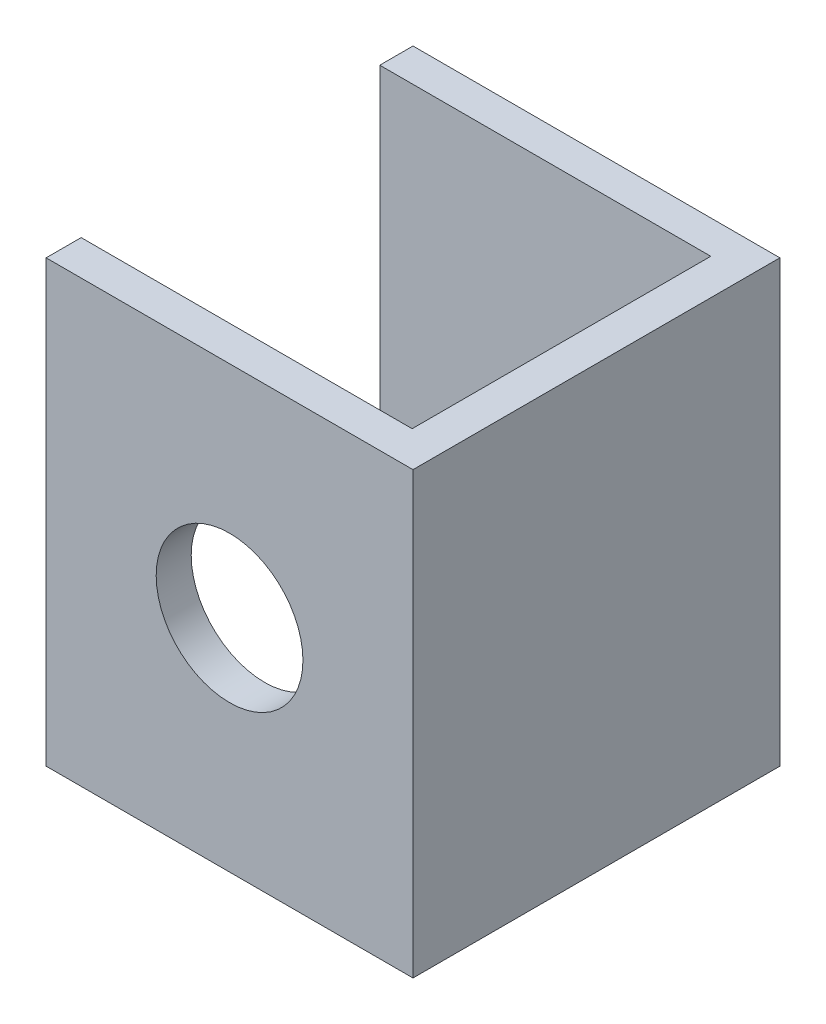
ISO-10303-21;
HEADER;
FILE_DESCRIPTION(('STEP AP214'),'2;1');
FILE_NAME('part.step','',(''),(''),'','','');
FILE_SCHEMA(('AUTOMOTIVE_DESIGN { 1 0 10303 214 1 1 1 1 }'));
ENDSEC;
DATA;
#1=APPLICATION_CONTEXT('core data for automotive mechanical design processes');
#2=APPLICATION_PROTOCOL_DEFINITION('international standard','automotive_design',2000,#1);
#3=PRODUCT_CONTEXT('',#1,'mechanical');
#4=PRODUCT('Part','Part','',(#3));
#5=PRODUCT_RELATED_PRODUCT_CATEGORY('part','',(#4));
#6=PRODUCT_DEFINITION_FORMATION('','',#4);
#7=PRODUCT_DEFINITION_CONTEXT('part definition',#1,'design');
#8=PRODUCT_DEFINITION('design','',#6,#7);
#9=PRODUCT_DEFINITION_SHAPE('','',#8);
#10=(LENGTH_UNIT() NAMED_UNIT(*) SI_UNIT(.MILLI.,.METRE.));
#11=(NAMED_UNIT(*) PLANE_ANGLE_UNIT() SI_UNIT($,.RADIAN.));
#12=(NAMED_UNIT(*) SI_UNIT($,.STERADIAN.) SOLID_ANGLE_UNIT());
#13=UNCERTAINTY_MEASURE_WITH_UNIT(LENGTH_MEASURE(1.E-05),#10,'distance_accuracy_value','');
#14=(GEOMETRIC_REPRESENTATION_CONTEXT(3) GLOBAL_UNCERTAINTY_ASSIGNED_CONTEXT((#13)) GLOBAL_UNIT_ASSIGNED_CONTEXT((#10,
#11,#12)) REPRESENTATION_CONTEXT('',''));
#15=CARTESIAN_POINT('',(0.,0.,0.));
#16=DIRECTION('',(0.,0.,1.));
#17=DIRECTION('',(1.,0.,0.));
#18=AXIS2_PLACEMENT_3D('',#15,#16,#17);
#19=CARTESIAN_POINT('',(0.,0.,0.));
#20=DIRECTION('',(1.,0.,0.));
#21=DIRECTION('',(0.,0.,-1.));
#22=AXIS2_PLACEMENT_3D('',#19,#20,#21);
#23=PLANE('',#22);
#24=DIRECTION('',(0.,0.,1.));
#25=VECTOR('',#24,1.);
#26=CARTESIAN_POINT('',(0.,37.3833238898768,-26.8421640295481));
#27=LINE('',#26,#25);
#28=CARTESIAN_POINT('',(0.,37.3833238898768,30.5946244034399));
#29=VERTEX_POINT('',#28);
#30=CARTESIAN_POINT('',(0.,37.3833238898768,36.6578359704519));
#31=VERTEX_POINT('',#30);
#32=EDGE_CURVE('E176',#29,#31,#27,.T.);
#33=ORIENTED_EDGE('',*,*,#32,.F.);
#34=DIRECTION('',(0.,-1.,0.));
#35=VECTOR('',#34,1.);
#36=CARTESIAN_POINT('',(0.,37.3833238898768,30.5946244034399));
#37=LINE('',#36,#35);
#38=CARTESIAN_POINT('',(0.,-38.8166761101232,30.5946244034398));
#39=VERTEX_POINT('',#38);
#40=EDGE_CURVE('E152',#29,#39,#37,.T.);
#41=ORIENTED_EDGE('',*,*,#40,.T.);
#42=DIRECTION('',(0.,0.,-1.));
#43=VECTOR('',#42,1.);
#44=CARTESIAN_POINT('',(0.,-38.8166761101232,-26.8421640295481));
#45=LINE('',#44,#43);
#46=CARTESIAN_POINT('',(0.,-38.8166761101232,36.6578359704519));
#47=VERTEX_POINT('',#46);
#48=EDGE_CURVE('E164',#47,#39,#45,.T.);
#49=ORIENTED_EDGE('',*,*,#48,.F.);
#50=DIRECTION('',(0.,-1.,0.));
#51=VECTOR('',#50,1.);
#52=CARTESIAN_POINT('',(0.,-38.8166761101232,36.6578359704519));
#53=LINE('',#52,#51);
#54=EDGE_CURVE('E179',#31,#47,#53,.T.);
#55=ORIENTED_EDGE('',*,*,#54,.F.);
#56=EDGE_LOOP('',(#33,#41,#49,#55));
#57=FACE_BOUND('',#56,.T.);
#58=ADVANCED_FACE('F41',(#57),#23,.F.);
#59=CARTESIAN_POINT('',(63.5,-38.8166761101232,-26.8421640295481));
#60=DIRECTION('',(0.,0.,1.));
#61=DIRECTION('',(1.,0.,0.));
#62=AXIS2_PLACEMENT_3D('',#59,#60,#61);
#63=PLANE('',#62);
#64=DIRECTION('',(0.,1.,0.));
#65=VECTOR('',#64,1.);
#66=CARTESIAN_POINT('',(0.,-38.8166761101232,-26.8421640295481));
#67=LINE('',#66,#65);
#68=CARTESIAN_POINT('',(0.,-38.8166761101232,-26.8421640295481));
#69=VERTEX_POINT('',#68);
#70=CARTESIAN_POINT('',(0.,37.3833238898768,-26.8421640295481));
#71=VERTEX_POINT('',#70);
#72=EDGE_CURVE('E156',#69,#71,#67,.T.);
#73=ORIENTED_EDGE('',*,*,#72,.T.);
#74=DIRECTION('',(-1.,0.,0.));
#75=VECTOR('',#74,1.);
#76=CARTESIAN_POINT('',(63.5,37.3833238898768,-26.8421640295481));
#77=LINE('',#76,#75);
#78=CARTESIAN_POINT('',(63.5,37.3833238898768,-26.8421640295481));
#79=VERTEX_POINT('',#78);
#80=EDGE_CURVE('E11',#79,#71,#77,.T.);
#81=ORIENTED_EDGE('',*,*,#80,.F.);
#82=DIRECTION('',(0.,1.,0.));
#83=VECTOR('',#82,1.);
#84=CARTESIAN_POINT('',(63.5,-38.8166761101232,-26.8421640295481));
#85=LINE('',#84,#83);
#86=CARTESIAN_POINT('',(63.5,-38.8166761101232,-26.8421640295481));
#87=VERTEX_POINT('',#86);
#88=EDGE_CURVE('E161',#87,#79,#85,.T.);
#89=ORIENTED_EDGE('',*,*,#88,.F.);
#90=DIRECTION('',(-1.,0.,0.));
#91=VECTOR('',#90,1.);
#92=CARTESIAN_POINT('',(63.5,-38.8166761101232,-26.8421640295481));
#93=LINE('',#92,#91);
#94=EDGE_CURVE('E172',#87,#69,#93,.T.);
#95=ORIENTED_EDGE('',*,*,#94,.T.);
#96=EDGE_LOOP('',(#73,#81,#89,#95));
#97=FACE_BOUND('',#96,.T.);
#98=ADVANCED_FACE('F43',(#97),#63,.F.);
#99=CARTESIAN_POINT('',(63.5,37.3833238898768,-26.8421640295481));
#100=DIRECTION('',(0.,-1.,0.));
#101=DIRECTION('',(0.,0.,-1.));
#102=AXIS2_PLACEMENT_3D('',#99,#100,#101);
#103=PLANE('',#102);
#104=DIRECTION('',(0.,0.,1.));
#105=VECTOR('',#104,1.);
#106=CARTESIAN_POINT('',(57.2887509634974,37.3833238898768,30.5946244034399));
#107=LINE('',#106,#105);
#108=CARTESIAN_POINT('',(57.2887509634974,37.3833238898768,-21.0937373749349));
#109=VERTEX_POINT('',#108);
#110=CARTESIAN_POINT('',(57.2887509634974,37.3833238898768,30.5946244034399));
#111=VERTEX_POINT('',#110);
#112=EDGE_CURVE('E126',#109,#111,#107,.T.);
#113=ORIENTED_EDGE('',*,*,#112,.T.);
#114=DIRECTION('',(-1.,0.,0.));
#115=VECTOR('',#114,1.);
#116=CARTESIAN_POINT('',(0.,37.3833238898768,30.5946244034399));
#117=LINE('',#116,#115);
#118=EDGE_CURVE('E131',#111,#29,#117,.T.);
#119=ORIENTED_EDGE('',*,*,#118,.T.);
#120=ORIENTED_EDGE('',*,*,#32,.T.);
#121=DIRECTION('',(-1.,0.,0.));
#122=VECTOR('',#121,1.);
#123=CARTESIAN_POINT('',(63.5,37.3833238898768,36.6578359704519));
#124=LINE('',#123,#122);
#125=CARTESIAN_POINT('',(63.5,37.3833238898768,36.6578359704519));
#126=VERTEX_POINT('',#125);
#127=EDGE_CURVE('E50',#126,#31,#124,.T.);
#128=ORIENTED_EDGE('',*,*,#127,.F.);
#129=DIRECTION('',(0.,0.,1.));
#130=VECTOR('',#129,1.);
#131=CARTESIAN_POINT('',(63.5,37.3833238898768,-26.8421640295481));
#132=LINE('',#131,#130);
#133=EDGE_CURVE('E94',#79,#126,#132,.T.);
#134=ORIENTED_EDGE('',*,*,#133,.F.);
#135=ORIENTED_EDGE('',*,*,#80,.T.);
#136=CARTESIAN_POINT('',(0.,37.3833238898768,-21.0937373749349));
#137=VERTEX_POINT('',#136);
#138=EDGE_CURVE('E135',#71,#137,#27,.T.);
#139=ORIENTED_EDGE('',*,*,#138,.T.);
#140=DIRECTION('',(1.,0.,0.));
#141=VECTOR('',#140,1.);
#142=CARTESIAN_POINT('',(0.,37.3833238898768,-21.0937373749349));
#143=LINE('',#142,#141);
#144=EDGE_CURVE('E57',#137,#109,#143,.T.);
#145=ORIENTED_EDGE('',*,*,#144,.T.);
#146=EDGE_LOOP('',(#113,#119,#120,#128,#134,#135,#139,#145));
#147=FACE_BOUND('',#146,.T.);
#148=ADVANCED_FACE('F134',(#147),#103,.F.);
#149=CARTESIAN_POINT('',(63.5,-38.8166761101232,36.6578359704519));
#150=DIRECTION('',(0.,0.,-1.));
#151=DIRECTION('',(-1.,0.,0.));
#152=AXIS2_PLACEMENT_3D('',#149,#150,#151);
#153=PLANE('',#152);
#154=CARTESIAN_POINT('',(31.75,-0.716676110123181,36.6578359704519));
#155=DIRECTION('',(0.,0.,1.));
#156=DIRECTION('',(1.,0.,0.));
#157=AXIS2_PLACEMENT_3D('',#154,#155,#156);
#158=CIRCLE('',#157,12.7);
#159=CARTESIAN_POINT('',(44.45,-0.716676110123181,36.6578359704519));
#160=VERTEX_POINT('',#159);
#161=EDGE_CURVE('E305',#160,#160,#158,.T.);
#162=ORIENTED_EDGE('',*,*,#161,.F.);
#163=EDGE_LOOP('',(#162));
#164=FACE_BOUND('',#163,.T.);
#165=ORIENTED_EDGE('',*,*,#54,.T.);
#166=DIRECTION('',(-1.,0.,0.));
#167=VECTOR('',#166,1.);
#168=CARTESIAN_POINT('',(63.5,-38.8166761101232,36.6578359704519));
#169=LINE('',#168,#167);
#170=CARTESIAN_POINT('',(63.5,-38.8166761101232,36.6578359704519));
#171=VERTEX_POINT('',#170);
#172=EDGE_CURVE('E187',#171,#47,#169,.T.);
#173=ORIENTED_EDGE('',*,*,#172,.F.);
#174=DIRECTION('',(0.,-1.,0.));
#175=VECTOR('',#174,1.);
#176=CARTESIAN_POINT('',(63.5,-38.8166761101232,36.6578359704519));
#177=LINE('',#176,#175);
#178=EDGE_CURVE('E167',#126,#171,#177,.T.);
#179=ORIENTED_EDGE('',*,*,#178,.F.);
#180=ORIENTED_EDGE('',*,*,#127,.T.);
#181=EDGE_LOOP('',(#165,#173,#179,#180));
#182=FACE_BOUND('',#181,.T.);
#183=ADVANCED_FACE('F195',(#164,#182),#153,.F.);
#184=CARTESIAN_POINT('',(63.5,-38.8166761101232,-26.8421640295481));
#185=DIRECTION('',(0.,1.,0.));
#186=DIRECTION('',(0.,0.,1.));
#187=AXIS2_PLACEMENT_3D('',#184,#185,#186);
#188=PLANE('',#187);
#189=ORIENTED_EDGE('',*,*,#48,.T.);
#190=DIRECTION('',(-1.,0.,0.));
#191=VECTOR('',#190,1.);
#192=CARTESIAN_POINT('',(0.,-38.8166761101232,30.5946244034398));
#193=LINE('',#192,#191);
#194=CARTESIAN_POINT('',(57.2887509634974,-38.8166761101232,30.5946244034398));
#195=VERTEX_POINT('',#194);
#196=EDGE_CURVE('E137',#195,#39,#193,.T.);
#197=ORIENTED_EDGE('',*,*,#196,.F.);
#198=DIRECTION('',(0.,0.,1.));
#199=VECTOR('',#198,1.);
#200=CARTESIAN_POINT('',(57.2887509634974,-38.8166761101232,30.5946244034398));
#201=LINE('',#200,#199);
#202=CARTESIAN_POINT('',(57.2887509634974,-38.8166761101232,-21.0937373749349));
#203=VERTEX_POINT('',#202);
#204=EDGE_CURVE('E140',#203,#195,#201,.T.);
#205=ORIENTED_EDGE('',*,*,#204,.F.);
#206=DIRECTION('',(1.,0.,0.));
#207=VECTOR('',#206,1.);
#208=CARTESIAN_POINT('',(0.,-38.8166761101232,-21.0937373749349));
#209=LINE('',#208,#207);
#210=CARTESIAN_POINT('',(0.,-38.8166761101232,-21.0937373749349));
#211=VERTEX_POINT('',#210);
#212=EDGE_CURVE('E117',#211,#203,#209,.T.);
#213=ORIENTED_EDGE('',*,*,#212,.F.);
#214=EDGE_CURVE('E87',#211,#69,#45,.T.);
#215=ORIENTED_EDGE('',*,*,#214,.T.);
#216=ORIENTED_EDGE('',*,*,#94,.F.);
#217=DIRECTION('',(0.,0.,-1.));
#218=VECTOR('',#217,1.);
#219=CARTESIAN_POINT('',(63.5,-38.8166761101232,-26.8421640295481));
#220=LINE('',#219,#218);
#221=EDGE_CURVE('E66',#171,#87,#220,.T.);
#222=ORIENTED_EDGE('',*,*,#221,.F.);
#223=ORIENTED_EDGE('',*,*,#172,.T.);
#224=EDGE_LOOP('',(#189,#197,#205,#213,#215,#216,#222,#223));
#225=FACE_BOUND('',#224,.T.);
#226=ADVANCED_FACE('F201',(#225),#188,.F.);
#227=CARTESIAN_POINT('',(63.5,0.,0.));
#228=DIRECTION('',(1.,0.,0.));
#229=DIRECTION('',(0.,0.,-1.));
#230=AXIS2_PLACEMENT_3D('',#227,#228,#229);
#231=PLANE('',#230);
#232=ORIENTED_EDGE('',*,*,#88,.T.);
#233=ORIENTED_EDGE('',*,*,#133,.T.);
#234=ORIENTED_EDGE('',*,*,#178,.T.);
#235=ORIENTED_EDGE('',*,*,#221,.T.);
#236=EDGE_LOOP('',(#232,#233,#234,#235));
#237=FACE_BOUND('',#236,.T.);
#238=ADVANCED_FACE('F206',(#237),#231,.T.);
#239=ORIENTED_EDGE('',*,*,#214,.F.);
#240=DIRECTION('',(0.,-1.,0.));
#241=VECTOR('',#240,1.);
#242=CARTESIAN_POINT('',(0.,37.3833238898768,-21.0937373749349));
#243=LINE('',#242,#241);
#244=EDGE_CURVE('E123',#137,#211,#243,.T.);
#245=ORIENTED_EDGE('',*,*,#244,.F.);
#246=ORIENTED_EDGE('',*,*,#138,.F.);
#247=ORIENTED_EDGE('',*,*,#72,.F.);
#248=EDGE_LOOP('',(#239,#245,#246,#247));
#249=FACE_BOUND('',#248,.T.);
#250=ADVANCED_FACE('F208',(#249),#23,.F.);
#251=CARTESIAN_POINT('',(0.,37.3833238898768,30.5946244034399));
#252=DIRECTION('',(0.,0.,1.));
#253=DIRECTION('',(0.,-1.,0.));
#254=AXIS2_PLACEMENT_3D('',#251,#252,#253);
#255=PLANE('',#254);
#256=CARTESIAN_POINT('',(31.75,-0.716676110123181,30.5946244034398));
#257=DIRECTION('',(0.,0.,1.));
#258=DIRECTION('',(0.,-1.,0.));
#259=AXIS2_PLACEMENT_3D('',#256,#257,#258);
#260=CIRCLE('',#259,12.7);
#261=CARTESIAN_POINT('',(31.75,-13.4166761101232,30.5946244034398));
#262=VERTEX_POINT('',#261);
#263=EDGE_CURVE('E143',#262,#262,#260,.F.);
#264=ORIENTED_EDGE('',*,*,#263,.F.);
#265=EDGE_LOOP('',(#264));
#266=FACE_BOUND('',#265,.T.);
#267=ORIENTED_EDGE('',*,*,#196,.T.);
#268=ORIENTED_EDGE('',*,*,#40,.F.);
#269=ORIENTED_EDGE('',*,*,#118,.F.);
#270=DIRECTION('',(0.,-1.,0.));
#271=VECTOR('',#270,1.);
#272=CARTESIAN_POINT('',(57.2887509634974,37.3833238898768,30.5946244034399));
#273=LINE('',#272,#271);
#274=EDGE_CURVE('E122',#111,#195,#273,.T.);
#275=ORIENTED_EDGE('',*,*,#274,.T.);
#276=EDGE_LOOP('',(#267,#268,#269,#275));
#277=FACE_BOUND('',#276,.T.);
#278=ADVANCED_FACE('F214',(#266,#277),#255,.F.);
#279=CARTESIAN_POINT('',(57.2887509634974,37.3833238898768,30.5946244034399));
#280=DIRECTION('',(1.,0.,0.));
#281=DIRECTION('',(0.,0.,-1.));
#282=AXIS2_PLACEMENT_3D('',#279,#280,#281);
#283=PLANE('',#282);
#284=ORIENTED_EDGE('',*,*,#204,.T.);
#285=ORIENTED_EDGE('',*,*,#274,.F.);
#286=ORIENTED_EDGE('',*,*,#112,.F.);
#287=DIRECTION('',(0.,-1.,0.));
#288=VECTOR('',#287,1.);
#289=CARTESIAN_POINT('',(57.2887509634974,37.3833238898768,-21.0937373749349));
#290=LINE('',#289,#288);
#291=EDGE_CURVE('E114',#109,#203,#290,.T.);
#292=ORIENTED_EDGE('',*,*,#291,.T.);
#293=EDGE_LOOP('',(#284,#285,#286,#292));
#294=FACE_BOUND('',#293,.T.);
#295=ADVANCED_FACE('F127',(#294),#283,.F.);
#296=CARTESIAN_POINT('',(0.,37.3833238898768,-21.0937373749349));
#297=DIRECTION('',(0.,0.,-1.));
#298=DIRECTION('',(0.,1.,0.));
#299=AXIS2_PLACEMENT_3D('',#296,#297,#298);
#300=PLANE('',#299);
#301=ORIENTED_EDGE('',*,*,#212,.T.);
#302=ORIENTED_EDGE('',*,*,#291,.F.);
#303=ORIENTED_EDGE('',*,*,#144,.F.);
#304=ORIENTED_EDGE('',*,*,#244,.T.);
#305=EDGE_LOOP('',(#301,#302,#303,#304));
#306=FACE_BOUND('',#305,.T.);
#307=ADVANCED_FACE('F116',(#306),#300,.F.);
#308=CARTESIAN_POINT('',(31.75,-0.716676110123181,-5.32640008083678));
#309=DIRECTION('',(0.,0.,1.));
#310=DIRECTION('',(1.,0.,0.));
#311=AXIS2_PLACEMENT_3D('',#308,#309,#310);
#312=CYLINDRICAL_SURFACE('',#311,12.7);
#313=ORIENTED_EDGE('',*,*,#263,.T.);
#314=EDGE_LOOP('',(#313));
#315=FACE_BOUND('',#314,.T.);
#316=ORIENTED_EDGE('',*,*,#161,.T.);
#317=EDGE_LOOP('',(#316));
#318=FACE_BOUND('',#317,.T.);
#319=ADVANCED_FACE('F266',(#315,#318),#312,.F.);
#320=CLOSED_SHELL('',(#58,#98,#148,#183,#226,#238,#250,#278,#295,#307,#319));
#321=MANIFOLD_SOLID_BREP('B2',#320);
#322=ADVANCED_BREP_SHAPE_REPRESENTATION('',(#18,#321),#14);
#323=SHAPE_DEFINITION_REPRESENTATION(#9,#322);
ENDSEC;
END-ISO-10303-21;
